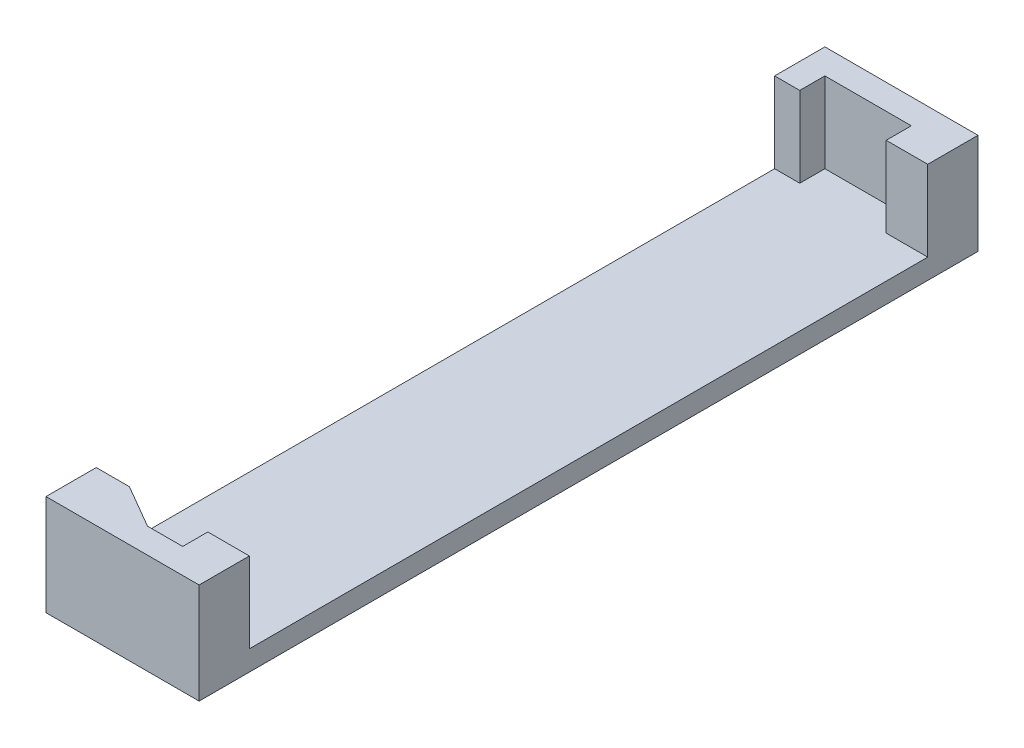
ISO-10303-21;
HEADER;
FILE_DESCRIPTION(('STEP AP214'),'2;1');
FILE_NAME('part.step','',(''),(''),'','','');
FILE_SCHEMA(('AUTOMOTIVE_DESIGN { 1 0 10303 214 1 1 1 1 }'));
ENDSEC;
DATA;
#1=APPLICATION_CONTEXT('core data for automotive mechanical design processes');
#2=APPLICATION_PROTOCOL_DEFINITION('international standard','automotive_design',2000,#1);
#3=PRODUCT_CONTEXT('',#1,'mechanical');
#4=PRODUCT('Part','Part','',(#3));
#5=PRODUCT_RELATED_PRODUCT_CATEGORY('part','',(#4));
#6=PRODUCT_DEFINITION_FORMATION('','',#4);
#7=PRODUCT_DEFINITION_CONTEXT('part definition',#1,'design');
#8=PRODUCT_DEFINITION('design','',#6,#7);
#9=PRODUCT_DEFINITION_SHAPE('','',#8);
#10=(LENGTH_UNIT() NAMED_UNIT(*) SI_UNIT(.MILLI.,.METRE.));
#11=(NAMED_UNIT(*) PLANE_ANGLE_UNIT() SI_UNIT($,.RADIAN.));
#12=(NAMED_UNIT(*) SI_UNIT($,.STERADIAN.) SOLID_ANGLE_UNIT());
#13=UNCERTAINTY_MEASURE_WITH_UNIT(LENGTH_MEASURE(1.E-05),#10,'distance_accuracy_value','');
#14=(GEOMETRIC_REPRESENTATION_CONTEXT(3) GLOBAL_UNCERTAINTY_ASSIGNED_CONTEXT((#13)) GLOBAL_UNIT_ASSIGNED_CONTEXT((#10,
#11,#12)) REPRESENTATION_CONTEXT('',''));
#15=CARTESIAN_POINT('',(0.,0.,0.));
#16=DIRECTION('',(0.,0.,1.));
#17=DIRECTION('',(1.,0.,0.));
#18=AXIS2_PLACEMENT_3D('',#15,#16,#17);
#19=CARTESIAN_POINT('',(0.,0.0254,0.));
#20=DIRECTION('',(0.,1.,0.));
#21=DIRECTION('',(0.,0.,1.));
#22=AXIS2_PLACEMENT_3D('',#19,#20,#21);
#23=PLANE('',#22);
#24=DIRECTION('',(0.,0.,-1.));
#25=VECTOR('',#24,1.);
#26=CARTESIAN_POINT('',(0.,0.0254,0.));
#27=LINE('',#26,#25);
#28=CARTESIAN_POINT('',(0.,0.0254,-12.7));
#29=VERTEX_POINT('',#28);
#30=CARTESIAN_POINT('',(0.,0.0254,-184.15));
#31=VERTEX_POINT('',#30);
#32=EDGE_CURVE('E265',#29,#31,#27,.T.);
#33=ORIENTED_EDGE('',*,*,#32,.F.);
#34=DIRECTION('',(-1.,0.,0.));
#35=VECTOR('',#34,1.);
#36=CARTESIAN_POINT('',(0.,0.0254,-12.7));
#37=LINE('',#36,#35);
#38=CARTESIAN_POINT('',(8.382,0.0254,-12.7));
#39=VERTEX_POINT('',#38);
#40=EDGE_CURVE('E194',#39,#29,#37,.T.);
#41=ORIENTED_EDGE('',*,*,#40,.F.);
#42=DIRECTION('',(-0.864507186684192,0.,-0.502620457374532));
#43=VECTOR('',#42,1.);
#44=CARTESIAN_POINT('',(8.382,0.0254,-12.7));
#45=LINE('',#44,#43);
#46=CARTESIAN_POINT('',(19.304,0.0254,-6.34999999999998));
#47=VERTEX_POINT('',#46);
#48=EDGE_CURVE('E174',#47,#39,#45,.T.);
#49=ORIENTED_EDGE('',*,*,#48,.F.);
#50=DIRECTION('',(-1.,0.,0.));
#51=VECTOR('',#50,1.);
#52=CARTESIAN_POINT('',(19.304,0.0254,-6.34999999999998));
#53=LINE('',#52,#51);
#54=CARTESIAN_POINT('',(28.194,0.0254,-6.35));
#55=VERTEX_POINT('',#54);
#56=EDGE_CURVE('E178',#55,#47,#53,.T.);
#57=ORIENTED_EDGE('',*,*,#56,.F.);
#58=DIRECTION('',(0.,0.,1.));
#59=VECTOR('',#58,1.);
#60=CARTESIAN_POINT('',(28.194,0.0254,-6.34999999999999));
#61=LINE('',#60,#59);
#62=CARTESIAN_POINT('',(28.194,0.0254,-12.7));
#63=VERTEX_POINT('',#62);
#64=EDGE_CURVE('E198',#63,#55,#61,.T.);
#65=ORIENTED_EDGE('',*,*,#64,.F.);
#66=DIRECTION('',(-1.,0.,0.));
#67=VECTOR('',#66,1.);
#68=CARTESIAN_POINT('',(28.194,0.0254,-12.7));
#69=LINE('',#68,#67);
#70=CARTESIAN_POINT('',(38.699948,0.0254,-12.7));
#71=VERTEX_POINT('',#70);
#72=EDGE_CURVE('E196',#71,#63,#69,.T.);
#73=ORIENTED_EDGE('',*,*,#72,.F.);
#74=DIRECTION('',(0.,0.,-1.));
#75=VECTOR('',#74,1.);
#76=CARTESIAN_POINT('',(38.699948,0.0254,0.));
#77=LINE('',#76,#75);
#78=CARTESIAN_POINT('',(38.699948,0.0254,-184.15));
#79=VERTEX_POINT('',#78);
#80=EDGE_CURVE('E263',#71,#79,#77,.T.);
#81=ORIENTED_EDGE('',*,*,#80,.T.);
#82=DIRECTION('',(1.,0.,0.));
#83=VECTOR('',#82,1.);
#84=CARTESIAN_POINT('',(28.194,0.0254,-184.15));
#85=LINE('',#84,#83);
#86=CARTESIAN_POINT('',(28.194,0.0254,-184.15));
#87=VERTEX_POINT('',#86);
#88=EDGE_CURVE('E240',#87,#79,#85,.T.);
#89=ORIENTED_EDGE('',*,*,#88,.F.);
#90=DIRECTION('',(0.,0.,1.));
#91=VECTOR('',#90,1.);
#92=CARTESIAN_POINT('',(28.194,0.0254,-190.5));
#93=LINE('',#92,#91);
#94=CARTESIAN_POINT('',(28.194,0.0254,-190.5));
#95=VERTEX_POINT('',#94);
#96=EDGE_CURVE('E237',#95,#87,#93,.T.);
#97=ORIENTED_EDGE('',*,*,#96,.F.);
#98=DIRECTION('',(1.,0.,0.));
#99=VECTOR('',#98,1.);
#100=CARTESIAN_POINT('',(27.94,0.0254,-190.5));
#101=LINE('',#100,#99);
#102=CARTESIAN_POINT('',(6.35,0.0254,-190.5));
#103=VERTEX_POINT('',#102);
#104=EDGE_CURVE('E215',#103,#95,#101,.T.);
#105=ORIENTED_EDGE('',*,*,#104,.F.);
#106=DIRECTION('',(0.,0.,-1.));
#107=VECTOR('',#106,1.);
#108=CARTESIAN_POINT('',(6.35,0.0254,-184.15));
#109=LINE('',#108,#107);
#110=CARTESIAN_POINT('',(6.35,0.0254,-184.15));
#111=VERTEX_POINT('',#110);
#112=EDGE_CURVE('E58',#111,#103,#109,.T.);
#113=ORIENTED_EDGE('',*,*,#112,.F.);
#114=DIRECTION('',(1.,0.,0.));
#115=VECTOR('',#114,1.);
#116=CARTESIAN_POINT('',(0.,0.0254,-184.15));
#117=LINE('',#116,#115);
#118=EDGE_CURVE('E243',#31,#111,#117,.T.);
#119=ORIENTED_EDGE('',*,*,#118,.F.);
#120=EDGE_LOOP('',(#33,#41,#49,#57,#65,#73,#81,#89,#97,#105,#113,#119));
#121=FACE_BOUND('',#120,.T.);
#122=ADVANCED_FACE('F35',(#121),#23,.T.);
#123=CARTESIAN_POINT('',(0.,0.0254,0.));
#124=DIRECTION('',(0.,0.,-1.));
#125=DIRECTION('',(-1.,0.,0.));
#126=AXIS2_PLACEMENT_3D('',#123,#124,#125);
#127=PLANE('',#126);
#128=DIRECTION('',(0.,-1.,0.));
#129=VECTOR('',#128,1.);
#130=CARTESIAN_POINT('',(0.,0.0254,0.));
#131=LINE('',#130,#129);
#132=CARTESIAN_POINT('',(0.,20.3454,0.));
#133=VERTEX_POINT('',#132);
#134=CARTESIAN_POINT('',(0.,-5.08,0.));
#135=VERTEX_POINT('',#134);
#136=EDGE_CURVE('E160',#133,#135,#131,.T.);
#137=ORIENTED_EDGE('',*,*,#136,.T.);
#138=DIRECTION('',(-1.,0.,0.));
#139=VECTOR('',#138,1.);
#140=CARTESIAN_POINT('',(38.699948,-5.08,0.));
#141=LINE('',#140,#139);
#142=CARTESIAN_POINT('',(38.699948,-5.08,0.));
#143=VERTEX_POINT('',#142);
#144=EDGE_CURVE('E159',#143,#135,#141,.T.);
#145=ORIENTED_EDGE('',*,*,#144,.F.);
#146=DIRECTION('',(0.,-1.,0.));
#147=VECTOR('',#146,1.);
#148=CARTESIAN_POINT('',(38.699948,0.0254,0.));
#149=LINE('',#148,#147);
#150=CARTESIAN_POINT('',(38.699948,20.3454,0.));
#151=VERTEX_POINT('',#150);
#152=EDGE_CURVE('E11',#151,#143,#149,.T.);
#153=ORIENTED_EDGE('',*,*,#152,.F.);
#154=DIRECTION('',(1.,0.,0.));
#155=VECTOR('',#154,1.);
#156=CARTESIAN_POINT('',(38.699948,20.3454,0.));
#157=LINE('',#156,#155);
#158=EDGE_CURVE('E183',#133,#151,#157,.T.);
#159=ORIENTED_EDGE('',*,*,#158,.F.);
#160=EDGE_LOOP('',(#137,#145,#153,#159));
#161=FACE_BOUND('',#160,.T.);
#162=ADVANCED_FACE('F37',(#161),#127,.F.);
#163=CARTESIAN_POINT('',(38.699948,0.0254,0.));
#164=DIRECTION('',(-1.,0.,0.));
#165=DIRECTION('',(0.,0.,1.));
#166=AXIS2_PLACEMENT_3D('',#163,#164,#165);
#167=PLANE('',#166);
#168=ORIENTED_EDGE('',*,*,#152,.T.);
#169=DIRECTION('',(0.,0.,1.));
#170=VECTOR('',#169,1.);
#171=CARTESIAN_POINT('',(38.699948,-5.08,0.));
#172=LINE('',#171,#170);
#173=CARTESIAN_POINT('',(38.699948,-5.08,-196.85));
#174=VERTEX_POINT('',#173);
#175=EDGE_CURVE('E152',#174,#143,#172,.T.);
#176=ORIENTED_EDGE('',*,*,#175,.F.);
#177=DIRECTION('',(0.,-1.,0.));
#178=VECTOR('',#177,1.);
#179=CARTESIAN_POINT('',(38.699948,0.0254,-196.85));
#180=LINE('',#179,#178);
#181=CARTESIAN_POINT('',(38.699948,20.3454,-196.85));
#182=VERTEX_POINT('',#181);
#183=EDGE_CURVE('E43',#182,#174,#180,.T.);
#184=ORIENTED_EDGE('',*,*,#183,.F.);
#185=DIRECTION('',(0.,0.,-1.));
#186=VECTOR('',#185,1.);
#187=CARTESIAN_POINT('',(38.699948,20.3454,-184.15));
#188=LINE('',#187,#186);
#189=CARTESIAN_POINT('',(38.699948,20.3454,-184.15));
#190=VERTEX_POINT('',#189);
#191=EDGE_CURVE('E222',#190,#182,#188,.T.);
#192=ORIENTED_EDGE('',*,*,#191,.F.);
#193=DIRECTION('',(0.,-1.,0.));
#194=VECTOR('',#193,1.);
#195=CARTESIAN_POINT('',(38.699948,20.3454,-184.15));
#196=LINE('',#195,#194);
#197=EDGE_CURVE('E254',#190,#79,#196,.T.);
#198=ORIENTED_EDGE('',*,*,#197,.T.);
#199=ORIENTED_EDGE('',*,*,#80,.F.);
#200=DIRECTION('',(0.,-1.,0.));
#201=VECTOR('',#200,1.);
#202=CARTESIAN_POINT('',(38.699948,20.3454,-12.7));
#203=LINE('',#202,#201);
#204=CARTESIAN_POINT('',(38.699948,20.3454,-12.7));
#205=VERTEX_POINT('',#204);
#206=EDGE_CURVE('E207',#205,#71,#203,.T.);
#207=ORIENTED_EDGE('',*,*,#206,.F.);
#208=DIRECTION('',(0.,0.,-1.));
#209=VECTOR('',#208,1.);
#210=CARTESIAN_POINT('',(38.699948,20.3454,-12.7));
#211=LINE('',#210,#209);
#212=EDGE_CURVE('E154',#151,#205,#211,.T.);
#213=ORIENTED_EDGE('',*,*,#212,.F.);
#214=EDGE_LOOP('',(#168,#176,#184,#192,#198,#199,#207,#213));
#215=FACE_BOUND('',#214,.T.);
#216=ADVANCED_FACE('F150',(#215),#167,.F.);
#217=CARTESIAN_POINT('',(0.,0.0254,-196.85));
#218=DIRECTION('',(0.,0.,-1.));
#219=DIRECTION('',(-1.,0.,0.));
#220=AXIS2_PLACEMENT_3D('',#217,#218,#219);
#221=PLANE('',#220);
#222=ORIENTED_EDGE('',*,*,#183,.T.);
#223=DIRECTION('',(1.,0.,0.));
#224=VECTOR('',#223,1.);
#225=CARTESIAN_POINT('',(38.699948,-5.08,-196.85));
#226=LINE('',#225,#224);
#227=CARTESIAN_POINT('',(0.,-5.08,-196.85));
#228=VERTEX_POINT('',#227);
#229=EDGE_CURVE('E169',#228,#174,#226,.T.);
#230=ORIENTED_EDGE('',*,*,#229,.F.);
#231=DIRECTION('',(0.,-1.,0.));
#232=VECTOR('',#231,1.);
#233=CARTESIAN_POINT('',(0.,0.0254,-196.85));
#234=LINE('',#233,#232);
#235=CARTESIAN_POINT('',(0.,20.3454,-196.85));
#236=VERTEX_POINT('',#235);
#237=EDGE_CURVE('E268',#236,#228,#234,.T.);
#238=ORIENTED_EDGE('',*,*,#237,.F.);
#239=DIRECTION('',(-1.,0.,0.));
#240=VECTOR('',#239,1.);
#241=CARTESIAN_POINT('',(38.699948,20.3454,-196.85));
#242=LINE('',#241,#240);
#243=EDGE_CURVE('E225',#182,#236,#242,.T.);
#244=ORIENTED_EDGE('',*,*,#243,.F.);
#245=EDGE_LOOP('',(#222,#230,#238,#244));
#246=FACE_BOUND('',#245,.T.);
#247=ADVANCED_FACE('F271',(#246),#221,.T.);
#248=CARTESIAN_POINT('',(0.,0.0254,0.));
#249=DIRECTION('',(-1.,0.,0.));
#250=DIRECTION('',(0.,0.,1.));
#251=AXIS2_PLACEMENT_3D('',#248,#249,#250);
#252=PLANE('',#251);
#253=ORIENTED_EDGE('',*,*,#237,.T.);
#254=DIRECTION('',(0.,0.,-1.));
#255=VECTOR('',#254,1.);
#256=CARTESIAN_POINT('',(0.,-5.08,0.));
#257=LINE('',#256,#255);
#258=EDGE_CURVE('E164',#135,#228,#257,.T.);
#259=ORIENTED_EDGE('',*,*,#258,.F.);
#260=ORIENTED_EDGE('',*,*,#136,.F.);
#261=DIRECTION('',(0.,0.,1.));
#262=VECTOR('',#261,1.);
#263=CARTESIAN_POINT('',(0.,20.3454,0.));
#264=LINE('',#263,#262);
#265=CARTESIAN_POINT('',(0.,20.3454,-12.7));
#266=VERTEX_POINT('',#265);
#267=EDGE_CURVE('E180',#266,#133,#264,.T.);
#268=ORIENTED_EDGE('',*,*,#267,.F.);
#269=DIRECTION('',(0.,-1.,0.));
#270=VECTOR('',#269,1.);
#271=CARTESIAN_POINT('',(0.,20.3454,-12.7));
#272=LINE('',#271,#270);
#273=EDGE_CURVE('E209',#266,#29,#272,.T.);
#274=ORIENTED_EDGE('',*,*,#273,.T.);
#275=ORIENTED_EDGE('',*,*,#32,.T.);
#276=DIRECTION('',(0.,-1.,0.));
#277=VECTOR('',#276,1.);
#278=CARTESIAN_POINT('',(0.,20.3454,-184.15));
#279=LINE('',#278,#277);
#280=CARTESIAN_POINT('',(0.,20.3454,-184.15));
#281=VERTEX_POINT('',#280);
#282=EDGE_CURVE('E251',#281,#31,#279,.T.);
#283=ORIENTED_EDGE('',*,*,#282,.F.);
#284=DIRECTION('',(0.,0.,1.));
#285=VECTOR('',#284,1.);
#286=CARTESIAN_POINT('',(0.,20.3454,-196.85));
#287=LINE('',#286,#285);
#288=EDGE_CURVE('E228',#236,#281,#287,.T.);
#289=ORIENTED_EDGE('',*,*,#288,.F.);
#290=EDGE_LOOP('',(#253,#259,#260,#268,#274,#275,#283,#289));
#291=FACE_BOUND('',#290,.T.);
#292=ADVANCED_FACE('F301',(#291),#252,.T.);
#293=CARTESIAN_POINT('',(27.94,20.3454,-190.5));
#294=DIRECTION('',(0.,0.,-1.));
#295=DIRECTION('',(-1.,0.,0.));
#296=AXIS2_PLACEMENT_3D('',#293,#294,#295);
#297=PLANE('',#296);
#298=ORIENTED_EDGE('',*,*,#104,.T.);
#299=DIRECTION('',(0.,-1.,0.));
#300=VECTOR('',#299,1.);
#301=CARTESIAN_POINT('',(28.194,20.3454,-190.5));
#302=LINE('',#301,#300);
#303=CARTESIAN_POINT('',(28.194,20.3454,-190.5));
#304=VERTEX_POINT('',#303);
#305=EDGE_CURVE('E260',#304,#95,#302,.T.);
#306=ORIENTED_EDGE('',*,*,#305,.F.);
#307=DIRECTION('',(1.,0.,0.));
#308=VECTOR('',#307,1.);
#309=CARTESIAN_POINT('',(6.35,20.3454,-190.5));
#310=LINE('',#309,#308);
#311=CARTESIAN_POINT('',(6.35,20.3454,-190.5));
#312=VERTEX_POINT('',#311);
#313=EDGE_CURVE('E216',#312,#304,#310,.T.);
#314=ORIENTED_EDGE('',*,*,#313,.F.);
#315=DIRECTION('',(0.,-1.,0.));
#316=VECTOR('',#315,1.);
#317=CARTESIAN_POINT('',(6.35,20.3454,-190.5));
#318=LINE('',#317,#316);
#319=EDGE_CURVE('E234',#312,#103,#318,.T.);
#320=ORIENTED_EDGE('',*,*,#319,.T.);
#321=EDGE_LOOP('',(#298,#306,#314,#320));
#322=FACE_BOUND('',#321,.T.);
#323=ADVANCED_FACE('F314',(#322),#297,.F.);
#324=CARTESIAN_POINT('',(28.194,20.3454,-190.5));
#325=DIRECTION('',(1.,0.,0.));
#326=DIRECTION('',(0.,0.,-1.));
#327=AXIS2_PLACEMENT_3D('',#324,#325,#326);
#328=PLANE('',#327);
#329=ORIENTED_EDGE('',*,*,#96,.T.);
#330=DIRECTION('',(0.,-1.,0.));
#331=VECTOR('',#330,1.);
#332=CARTESIAN_POINT('',(28.194,20.3454,-184.15));
#333=LINE('',#332,#331);
#334=CARTESIAN_POINT('',(28.194,20.3454,-184.15));
#335=VERTEX_POINT('',#334);
#336=EDGE_CURVE('E257',#335,#87,#333,.T.);
#337=ORIENTED_EDGE('',*,*,#336,.F.);
#338=DIRECTION('',(0.,0.,1.));
#339=VECTOR('',#338,1.);
#340=CARTESIAN_POINT('',(28.194,20.3454,-190.5));
#341=LINE('',#340,#339);
#342=EDGE_CURVE('E218',#304,#335,#341,.T.);
#343=ORIENTED_EDGE('',*,*,#342,.F.);
#344=ORIENTED_EDGE('',*,*,#305,.T.);
#345=EDGE_LOOP('',(#329,#337,#343,#344));
#346=FACE_BOUND('',#345,.T.);
#347=ADVANCED_FACE('F316',(#346),#328,.F.);
#348=CARTESIAN_POINT('',(28.194,20.3454,-184.15));
#349=DIRECTION('',(0.,0.,-1.));
#350=DIRECTION('',(-1.,0.,0.));
#351=AXIS2_PLACEMENT_3D('',#348,#349,#350);
#352=PLANE('',#351);
#353=ORIENTED_EDGE('',*,*,#88,.T.);
#354=ORIENTED_EDGE('',*,*,#197,.F.);
#355=DIRECTION('',(1.,0.,0.));
#356=VECTOR('',#355,1.);
#357=CARTESIAN_POINT('',(28.194,20.3454,-184.15));
#358=LINE('',#357,#356);
#359=EDGE_CURVE('E220',#335,#190,#358,.T.);
#360=ORIENTED_EDGE('',*,*,#359,.F.);
#361=ORIENTED_EDGE('',*,*,#336,.T.);
#362=EDGE_LOOP('',(#353,#354,#360,#361));
#363=FACE_BOUND('',#362,.T.);
#364=ADVANCED_FACE('F281',(#363),#352,.F.);
#365=CARTESIAN_POINT('',(0.,20.3454,-184.15));
#366=DIRECTION('',(0.,0.,-1.));
#367=DIRECTION('',(-1.,0.,0.));
#368=AXIS2_PLACEMENT_3D('',#365,#366,#367);
#369=PLANE('',#368);
#370=ORIENTED_EDGE('',*,*,#118,.T.);
#371=DIRECTION('',(0.,-1.,0.));
#372=VECTOR('',#371,1.);
#373=CARTESIAN_POINT('',(6.35,20.3454,-184.15));
#374=LINE('',#373,#372);
#375=CARTESIAN_POINT('',(6.35,20.3454,-184.15));
#376=VERTEX_POINT('',#375);
#377=EDGE_CURVE('E248',#376,#111,#374,.T.);
#378=ORIENTED_EDGE('',*,*,#377,.F.);
#379=DIRECTION('',(1.,0.,0.));
#380=VECTOR('',#379,1.);
#381=CARTESIAN_POINT('',(0.,20.3454,-184.15));
#382=LINE('',#381,#380);
#383=EDGE_CURVE('E230',#281,#376,#382,.T.);
#384=ORIENTED_EDGE('',*,*,#383,.F.);
#385=ORIENTED_EDGE('',*,*,#282,.T.);
#386=EDGE_LOOP('',(#370,#378,#384,#385));
#387=FACE_BOUND('',#386,.T.);
#388=ADVANCED_FACE('F308',(#387),#369,.F.);
#389=CARTESIAN_POINT('',(6.35,20.3454,-184.15));
#390=DIRECTION('',(-1.,0.,0.));
#391=DIRECTION('',(0.,0.,1.));
#392=AXIS2_PLACEMENT_3D('',#389,#390,#391);
#393=PLANE('',#392);
#394=ORIENTED_EDGE('',*,*,#112,.T.);
#395=ORIENTED_EDGE('',*,*,#319,.F.);
#396=DIRECTION('',(0.,0.,-1.));
#397=VECTOR('',#396,1.);
#398=CARTESIAN_POINT('',(6.35,20.3454,-184.15));
#399=LINE('',#398,#397);
#400=EDGE_CURVE('E232',#376,#312,#399,.T.);
#401=ORIENTED_EDGE('',*,*,#400,.F.);
#402=ORIENTED_EDGE('',*,*,#377,.T.);
#403=EDGE_LOOP('',(#394,#395,#401,#402));
#404=FACE_BOUND('',#403,.T.);
#405=ADVANCED_FACE('F310',(#404),#393,.F.);
#406=CARTESIAN_POINT('',(0.,20.3454,0.));
#407=DIRECTION('',(0.,-1.,0.));
#408=DIRECTION('',(0.,0.,-1.));
#409=AXIS2_PLACEMENT_3D('',#406,#407,#408);
#410=PLANE('',#409);
#411=ORIENTED_EDGE('',*,*,#313,.T.);
#412=ORIENTED_EDGE('',*,*,#342,.T.);
#413=ORIENTED_EDGE('',*,*,#359,.T.);
#414=ORIENTED_EDGE('',*,*,#191,.T.);
#415=ORIENTED_EDGE('',*,*,#243,.T.);
#416=ORIENTED_EDGE('',*,*,#288,.T.);
#417=ORIENTED_EDGE('',*,*,#383,.T.);
#418=ORIENTED_EDGE('',*,*,#400,.T.);
#419=EDGE_LOOP('',(#411,#412,#413,#414,#415,#416,#417,#418));
#420=FACE_BOUND('',#419,.T.);
#421=ADVANCED_FACE('F274',(#420),#410,.F.);
#422=CARTESIAN_POINT('',(8.382,20.3454,-12.7));
#423=DIRECTION('',(-0.502620457374532,0.,0.864507186684192));
#424=DIRECTION('',(0.864507186684192,0.,0.502620457374532));
#425=AXIS2_PLACEMENT_3D('',#422,#423,#424);
#426=PLANE('',#425);
#427=ORIENTED_EDGE('',*,*,#48,.T.);
#428=DIRECTION('',(0.,-1.,0.));
#429=VECTOR('',#428,1.);
#430=CARTESIAN_POINT('',(8.382,20.3454,-12.7));
#431=LINE('',#430,#429);
#432=CARTESIAN_POINT('',(8.382,20.3454,-12.7));
#433=VERTEX_POINT('',#432);
#434=EDGE_CURVE('E212',#433,#39,#431,.T.);
#435=ORIENTED_EDGE('',*,*,#434,.F.);
#436=DIRECTION('',(-0.86450718668419,0.,-0.502620457374535));
#437=VECTOR('',#436,1.);
#438=CARTESIAN_POINT('',(16.002,20.3454,-8.26976744186047));
#439=LINE('',#438,#437);
#440=CARTESIAN_POINT('',(19.304,20.3454,-6.34999999999998));
#441=VERTEX_POINT('',#440);
#442=EDGE_CURVE('E175',#441,#433,#439,.T.);
#443=ORIENTED_EDGE('',*,*,#442,.F.);
#444=DIRECTION('',(0.,-1.,0.));
#445=VECTOR('',#444,1.);
#446=CARTESIAN_POINT('',(19.304,20.3454,-6.34999999999998));
#447=LINE('',#446,#445);
#448=EDGE_CURVE('E192',#441,#47,#447,.T.);
#449=ORIENTED_EDGE('',*,*,#448,.T.);
#450=EDGE_LOOP('',(#427,#435,#443,#449));
#451=FACE_BOUND('',#450,.T.);
#452=ADVANCED_FACE('F390',(#451),#426,.F.);
#453=CARTESIAN_POINT('',(0.,20.3454,-12.7));
#454=DIRECTION('',(0.,0.,1.));
#455=DIRECTION('',(1.,0.,0.));
#456=AXIS2_PLACEMENT_3D('',#453,#454,#455);
#457=PLANE('',#456);
#458=ORIENTED_EDGE('',*,*,#40,.T.);
#459=ORIENTED_EDGE('',*,*,#273,.F.);
#460=DIRECTION('',(-1.,0.,0.));
#461=VECTOR('',#460,1.);
#462=CARTESIAN_POINT('',(0.,20.3454,-12.7));
#463=LINE('',#462,#461);
#464=EDGE_CURVE('E177',#433,#266,#463,.T.);
#465=ORIENTED_EDGE('',*,*,#464,.F.);
#466=ORIENTED_EDGE('',*,*,#434,.T.);
#467=EDGE_LOOP('',(#458,#459,#465,#466));
#468=FACE_BOUND('',#467,.T.);
#469=ADVANCED_FACE('F400',(#468),#457,.F.);
#470=CARTESIAN_POINT('',(28.194,20.3454,-12.7));
#471=DIRECTION('',(0.,0.,1.));
#472=DIRECTION('',(1.,0.,0.));
#473=AXIS2_PLACEMENT_3D('',#470,#471,#472);
#474=PLANE('',#473);
#475=ORIENTED_EDGE('',*,*,#72,.T.);
#476=DIRECTION('',(0.,-1.,0.));
#477=VECTOR('',#476,1.);
#478=CARTESIAN_POINT('',(28.194,20.3454,-12.7));
#479=LINE('',#478,#477);
#480=CARTESIAN_POINT('',(28.194,20.3454,-12.7));
#481=VERTEX_POINT('',#480);
#482=EDGE_CURVE('E204',#481,#63,#479,.T.);
#483=ORIENTED_EDGE('',*,*,#482,.F.);
#484=DIRECTION('',(-1.,0.,0.));
#485=VECTOR('',#484,1.);
#486=CARTESIAN_POINT('',(28.194,20.3454,-12.7));
#487=LINE('',#486,#485);
#488=EDGE_CURVE('E186',#205,#481,#487,.T.);
#489=ORIENTED_EDGE('',*,*,#488,.F.);
#490=ORIENTED_EDGE('',*,*,#206,.T.);
#491=EDGE_LOOP('',(#475,#483,#489,#490));
#492=FACE_BOUND('',#491,.T.);
#493=ADVANCED_FACE('F290',(#492),#474,.F.);
#494=CARTESIAN_POINT('',(28.194,20.3454,-6.34999999999999));
#495=DIRECTION('',(1.,0.,0.));
#496=DIRECTION('',(0.,0.,-1.));
#497=AXIS2_PLACEMENT_3D('',#494,#495,#496);
#498=PLANE('',#497);
#499=ORIENTED_EDGE('',*,*,#64,.T.);
#500=DIRECTION('',(0.,-1.,0.));
#501=VECTOR('',#500,1.);
#502=CARTESIAN_POINT('',(28.194,20.3454,-6.34999999999999));
#503=LINE('',#502,#501);
#504=CARTESIAN_POINT('',(28.194,20.3454,-6.34999999999999));
#505=VERTEX_POINT('',#504);
#506=EDGE_CURVE('E50',#505,#55,#503,.T.);
#507=ORIENTED_EDGE('',*,*,#506,.F.);
#508=DIRECTION('',(0.,0.,1.));
#509=VECTOR('',#508,1.);
#510=CARTESIAN_POINT('',(28.194,20.3454,-6.34999999999999));
#511=LINE('',#510,#509);
#512=EDGE_CURVE('E188',#481,#505,#511,.T.);
#513=ORIENTED_EDGE('',*,*,#512,.F.);
#514=ORIENTED_EDGE('',*,*,#482,.T.);
#515=EDGE_LOOP('',(#499,#507,#513,#514));
#516=FACE_BOUND('',#515,.T.);
#517=ADVANCED_FACE('F293',(#516),#498,.F.);
#518=CARTESIAN_POINT('',(19.304,20.3454,-6.34999999999998));
#519=DIRECTION('',(0.,0.,1.));
#520=DIRECTION('',(1.,0.,0.));
#521=AXIS2_PLACEMENT_3D('',#518,#519,#520);
#522=PLANE('',#521);
#523=ORIENTED_EDGE('',*,*,#56,.T.);
#524=ORIENTED_EDGE('',*,*,#448,.F.);
#525=DIRECTION('',(-1.,0.,0.));
#526=VECTOR('',#525,1.);
#527=CARTESIAN_POINT('',(27.94,20.3454,-6.34999999999999));
#528=LINE('',#527,#526);
#529=EDGE_CURVE('E190',#505,#441,#528,.T.);
#530=ORIENTED_EDGE('',*,*,#529,.F.);
#531=ORIENTED_EDGE('',*,*,#506,.T.);
#532=EDGE_LOOP('',(#523,#524,#530,#531));
#533=FACE_BOUND('',#532,.T.);
#534=ADVANCED_FACE('F427',(#533),#522,.F.);
#535=CARTESIAN_POINT('',(0.,20.3454,0.));
#536=DIRECTION('',(0.,1.,0.));
#537=DIRECTION('',(0.,0.,1.));
#538=AXIS2_PLACEMENT_3D('',#535,#536,#537);
#539=PLANE('',#538);
#540=ORIENTED_EDGE('',*,*,#442,.T.);
#541=ORIENTED_EDGE('',*,*,#464,.T.);
#542=ORIENTED_EDGE('',*,*,#267,.T.);
#543=ORIENTED_EDGE('',*,*,#158,.T.);
#544=ORIENTED_EDGE('',*,*,#212,.T.);
#545=ORIENTED_EDGE('',*,*,#488,.T.);
#546=ORIENTED_EDGE('',*,*,#512,.T.);
#547=ORIENTED_EDGE('',*,*,#529,.T.);
#548=EDGE_LOOP('',(#540,#541,#542,#543,#544,#545,#546,#547));
#549=FACE_BOUND('',#548,.T.);
#550=ADVANCED_FACE('F295',(#549),#539,.T.);
#551=CARTESIAN_POINT('',(0.,-5.08,0.));
#552=DIRECTION('',(0.,1.,0.));
#553=DIRECTION('',(0.,0.,1.));
#554=AXIS2_PLACEMENT_3D('',#551,#552,#553);
#555=PLANE('',#554);
#556=ORIENTED_EDGE('',*,*,#175,.T.);
#557=ORIENTED_EDGE('',*,*,#144,.T.);
#558=ORIENTED_EDGE('',*,*,#258,.T.);
#559=ORIENTED_EDGE('',*,*,#229,.T.);
#560=EDGE_LOOP('',(#556,#557,#558,#559));
#561=FACE_BOUND('',#560,.T.);
#562=ADVANCED_FACE('F167',(#561),#555,.F.);
#563=CLOSED_SHELL('',(#122,#162,#216,#247,#292,#323,#347,#364,#388,#405,#421,#452,#469,#493,
#517,#534,#550,#562));
#564=MANIFOLD_SOLID_BREP('B2',#563);
#565=ADVANCED_BREP_SHAPE_REPRESENTATION('',(#18,#564),#14);
#566=SHAPE_DEFINITION_REPRESENTATION(#9,#565);
ENDSEC;
END-ISO-10303-21;
